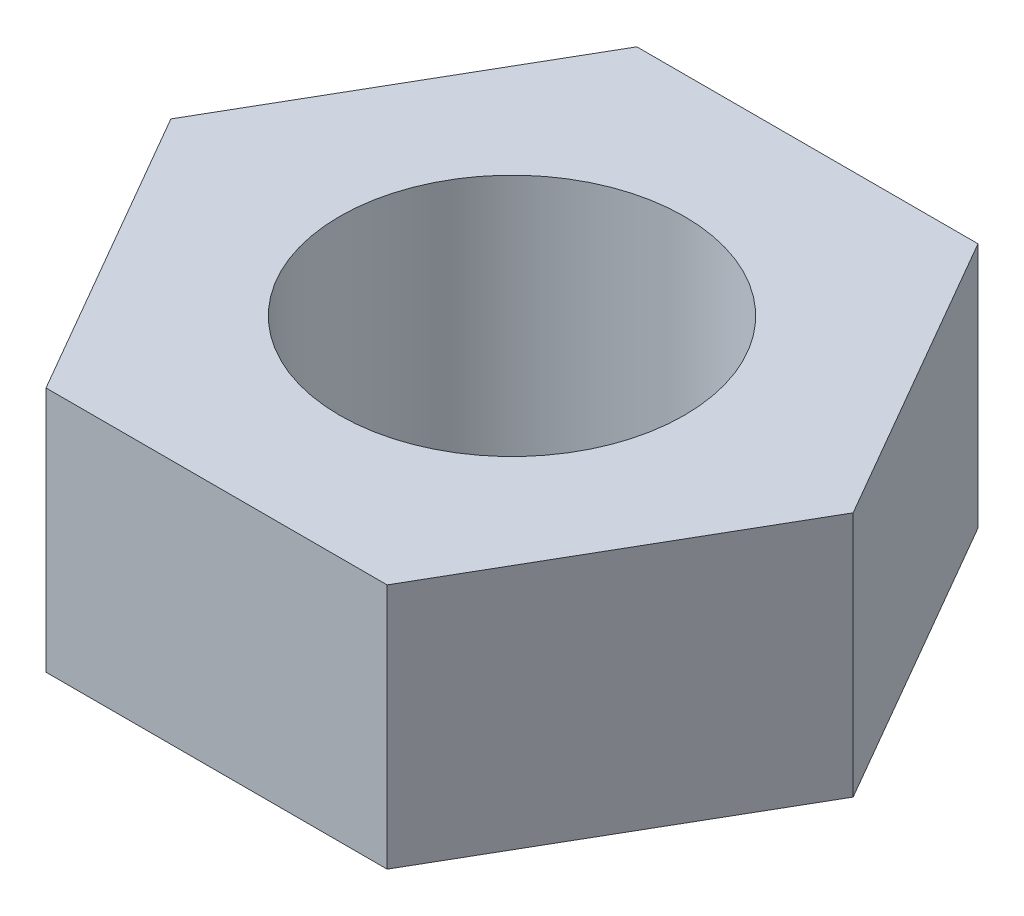
ISO-10303-21;
HEADER;
FILE_DESCRIPTION(('STEP AP214'),'2;1');
FILE_NAME('part.step','',(''),(''),'','','');
FILE_SCHEMA(('AUTOMOTIVE_DESIGN { 1 0 10303 214 1 1 1 1 }'));
ENDSEC;
DATA;
#1=APPLICATION_CONTEXT('core data for automotive mechanical design processes');
#2=APPLICATION_PROTOCOL_DEFINITION('international standard','automotive_design',2000,#1);
#3=PRODUCT_CONTEXT('',#1,'mechanical');
#4=PRODUCT('Part','Part','',(#3));
#5=PRODUCT_RELATED_PRODUCT_CATEGORY('part','',(#4));
#6=PRODUCT_DEFINITION_FORMATION('','',#4);
#7=PRODUCT_DEFINITION_CONTEXT('part definition',#1,'design');
#8=PRODUCT_DEFINITION('design','',#6,#7);
#9=PRODUCT_DEFINITION_SHAPE('','',#8);
#10=(LENGTH_UNIT() NAMED_UNIT(*) SI_UNIT(.MILLI.,.METRE.));
#11=(NAMED_UNIT(*) PLANE_ANGLE_UNIT() SI_UNIT($,.RADIAN.));
#12=(NAMED_UNIT(*) SI_UNIT($,.STERADIAN.) SOLID_ANGLE_UNIT());
#13=UNCERTAINTY_MEASURE_WITH_UNIT(LENGTH_MEASURE(1.E-05),#10,'distance_accuracy_value','');
#14=(GEOMETRIC_REPRESENTATION_CONTEXT(3) GLOBAL_UNCERTAINTY_ASSIGNED_CONTEXT((#13)) GLOBAL_UNIT_ASSIGNED_CONTEXT((#10,
#11,#12)) REPRESENTATION_CONTEXT('',''));
#15=CARTESIAN_POINT('',(0.,0.,0.));
#16=DIRECTION('',(0.,0.,1.));
#17=DIRECTION('',(1.,0.,0.));
#18=AXIS2_PLACEMENT_3D('',#15,#16,#17);
#19=CARTESIAN_POINT('',(13.856406460551,-10.,0.));
#20=DIRECTION('',(0.866025403784439,0.,-0.5));
#21=DIRECTION('',(-0.5,0.,-0.866025403784439));
#22=AXIS2_PLACEMENT_3D('',#19,#20,#21);
#23=PLANE('',#22);
#24=DIRECTION('',(-0.5,0.,-0.866025403784439));
#25=VECTOR('',#24,1.);
#26=CARTESIAN_POINT('',(13.856406460551,0.,0.));
#27=LINE('',#26,#25);
#28=CARTESIAN_POINT('',(13.856406460551,0.,0.));
#29=VERTEX_POINT('',#28);
#30=CARTESIAN_POINT('',(6.92820323027551,0.,-12.));
#31=VERTEX_POINT('',#30);
#32=EDGE_CURVE('E136',#29,#31,#27,.T.);
#33=ORIENTED_EDGE('',*,*,#32,.F.);
#34=DIRECTION('',(0.,1.,0.));
#35=VECTOR('',#34,1.);
#36=CARTESIAN_POINT('',(13.856406460551,-10.,0.));
#37=LINE('',#36,#35);
#38=CARTESIAN_POINT('',(13.856406460551,-10.,0.));
#39=VERTEX_POINT('',#38);
#40=EDGE_CURVE('E11',#39,#29,#37,.T.);
#41=ORIENTED_EDGE('',*,*,#40,.F.);
#42=DIRECTION('',(-0.5,0.,-0.866025403784439));
#43=VECTOR('',#42,1.);
#44=CARTESIAN_POINT('',(13.856406460551,-10.,0.));
#45=LINE('',#44,#43);
#46=CARTESIAN_POINT('',(6.92820323027551,-10.,-12.));
#47=VERTEX_POINT('',#46);
#48=EDGE_CURVE('E157',#39,#47,#45,.T.);
#49=ORIENTED_EDGE('',*,*,#48,.T.);
#50=DIRECTION('',(0.,1.,0.));
#51=VECTOR('',#50,1.);
#52=CARTESIAN_POINT('',(6.92820323027551,-10.,-12.));
#53=LINE('',#52,#51);
#54=EDGE_CURVE('E48',#47,#31,#53,.T.);
#55=ORIENTED_EDGE('',*,*,#54,.T.);
#56=EDGE_LOOP('',(#33,#41,#49,#55));
#57=FACE_BOUND('',#56,.T.);
#58=ADVANCED_FACE('F45',(#57),#23,.T.);
#59=CARTESIAN_POINT('',(6.92820323027552,-10.,12.));
#60=DIRECTION('',(0.866025403784439,0.,0.5));
#61=DIRECTION('',(0.5,0.,-0.866025403784439));
#62=AXIS2_PLACEMENT_3D('',#59,#60,#61);
#63=PLANE('',#62);
#64=DIRECTION('',(0.5,0.,-0.866025403784439));
#65=VECTOR('',#64,1.);
#66=CARTESIAN_POINT('',(6.92820323027552,0.,12.));
#67=LINE('',#66,#65);
#68=CARTESIAN_POINT('',(6.92820323027552,0.,12.));
#69=VERTEX_POINT('',#68);
#70=EDGE_CURVE('E154',#69,#29,#67,.T.);
#71=ORIENTED_EDGE('',*,*,#70,.F.);
#72=DIRECTION('',(0.,1.,0.));
#73=VECTOR('',#72,1.);
#74=CARTESIAN_POINT('',(6.92820323027552,-10.,12.));
#75=LINE('',#74,#73);
#76=CARTESIAN_POINT('',(6.92820323027552,-10.,12.));
#77=VERTEX_POINT('',#76);
#78=EDGE_CURVE('E55',#77,#69,#75,.T.);
#79=ORIENTED_EDGE('',*,*,#78,.F.);
#80=DIRECTION('',(0.5,0.,-0.866025403784439));
#81=VECTOR('',#80,1.);
#82=CARTESIAN_POINT('',(6.92820323027552,-10.,12.));
#83=LINE('',#82,#81);
#84=EDGE_CURVE('E122',#77,#39,#83,.T.);
#85=ORIENTED_EDGE('',*,*,#84,.T.);
#86=ORIENTED_EDGE('',*,*,#40,.T.);
#87=EDGE_LOOP('',(#71,#79,#85,#86));
#88=FACE_BOUND('',#87,.T.);
#89=ADVANCED_FACE('F169',(#88),#63,.T.);
#90=CARTESIAN_POINT('',(-6.92820323027551,-10.,12.));
#91=DIRECTION('',(0.,0.,1.));
#92=DIRECTION('',(1.,0.,0.));
#93=AXIS2_PLACEMENT_3D('',#90,#91,#92);
#94=PLANE('',#93);
#95=DIRECTION('',(1.,0.,0.));
#96=VECTOR('',#95,1.);
#97=CARTESIAN_POINT('',(-6.92820323027551,0.,12.));
#98=LINE('',#97,#96);
#99=CARTESIAN_POINT('',(-6.92820323027551,0.,12.));
#100=VERTEX_POINT('',#99);
#101=EDGE_CURVE('E108',#100,#69,#98,.T.);
#102=ORIENTED_EDGE('',*,*,#101,.F.);
#103=DIRECTION('',(0.,1.,0.));
#104=VECTOR('',#103,1.);
#105=CARTESIAN_POINT('',(-6.92820323027551,-10.,12.));
#106=LINE('',#105,#104);
#107=CARTESIAN_POINT('',(-6.92820323027551,-10.,12.));
#108=VERTEX_POINT('',#107);
#109=EDGE_CURVE('E103',#108,#100,#106,.T.);
#110=ORIENTED_EDGE('',*,*,#109,.F.);
#111=DIRECTION('',(1.,0.,0.));
#112=VECTOR('',#111,1.);
#113=CARTESIAN_POINT('',(-6.92820323027551,-10.,12.));
#114=LINE('',#113,#112);
#115=EDGE_CURVE('E106',#108,#77,#114,.T.);
#116=ORIENTED_EDGE('',*,*,#115,.T.);
#117=ORIENTED_EDGE('',*,*,#78,.T.);
#118=EDGE_LOOP('',(#102,#110,#116,#117));
#119=FACE_BOUND('',#118,.T.);
#120=ADVANCED_FACE('F105',(#119),#94,.T.);
#121=CARTESIAN_POINT('',(-13.856406460551,-10.,0.));
#122=DIRECTION('',(-0.866025403784438,0.,0.5));
#123=DIRECTION('',(0.5,0.,0.866025403784438));
#124=AXIS2_PLACEMENT_3D('',#121,#122,#123);
#125=PLANE('',#124);
#126=DIRECTION('',(0.5,0.,0.866025403784439));
#127=VECTOR('',#126,1.);
#128=CARTESIAN_POINT('',(-13.856406460551,0.,0.));
#129=LINE('',#128,#127);
#130=CARTESIAN_POINT('',(-13.856406460551,0.,0.));
#131=VERTEX_POINT('',#130);
#132=EDGE_CURVE('E149',#131,#100,#129,.T.);
#133=ORIENTED_EDGE('',*,*,#132,.F.);
#134=DIRECTION('',(0.,1.,0.));
#135=VECTOR('',#134,1.);
#136=CARTESIAN_POINT('',(-13.856406460551,-10.,0.));
#137=LINE('',#136,#135);
#138=CARTESIAN_POINT('',(-13.856406460551,-10.,0.));
#139=VERTEX_POINT('',#138);
#140=EDGE_CURVE('E114',#139,#131,#137,.T.);
#141=ORIENTED_EDGE('',*,*,#140,.F.);
#142=DIRECTION('',(0.5,0.,0.866025403784439));
#143=VECTOR('',#142,1.);
#144=CARTESIAN_POINT('',(-13.856406460551,-10.,0.));
#145=LINE('',#144,#143);
#146=EDGE_CURVE('E120',#139,#108,#145,.T.);
#147=ORIENTED_EDGE('',*,*,#146,.T.);
#148=ORIENTED_EDGE('',*,*,#109,.T.);
#149=EDGE_LOOP('',(#133,#141,#147,#148));
#150=FACE_BOUND('',#149,.T.);
#151=ADVANCED_FACE('F125',(#150),#125,.T.);
#152=CARTESIAN_POINT('',(-6.92820323027551,-10.,-12.));
#153=DIRECTION('',(-0.866025403784439,0.,-0.5));
#154=DIRECTION('',(-0.5,0.,0.866025403784439));
#155=AXIS2_PLACEMENT_3D('',#152,#153,#154);
#156=PLANE('',#155);
#157=DIRECTION('',(-0.5,0.,0.866025403784439));
#158=VECTOR('',#157,1.);
#159=CARTESIAN_POINT('',(-6.92820323027551,0.,-12.));
#160=LINE('',#159,#158);
#161=CARTESIAN_POINT('',(-6.92820323027551,0.,-12.));
#162=VERTEX_POINT('',#161);
#163=EDGE_CURVE('E145',#162,#131,#160,.T.);
#164=ORIENTED_EDGE('',*,*,#163,.F.);
#165=DIRECTION('',(0.,1.,0.));
#166=VECTOR('',#165,1.);
#167=CARTESIAN_POINT('',(-6.92820323027551,-10.,-12.));
#168=LINE('',#167,#166);
#169=CARTESIAN_POINT('',(-6.92820323027551,-10.,-12.));
#170=VERTEX_POINT('',#169);
#171=EDGE_CURVE('E162',#170,#162,#168,.T.);
#172=ORIENTED_EDGE('',*,*,#171,.F.);
#173=DIRECTION('',(-0.5,0.,0.866025403784439));
#174=VECTOR('',#173,1.);
#175=CARTESIAN_POINT('',(-6.92820323027551,-10.,-12.));
#176=LINE('',#175,#174);
#177=EDGE_CURVE('E127',#170,#139,#176,.T.);
#178=ORIENTED_EDGE('',*,*,#177,.T.);
#179=ORIENTED_EDGE('',*,*,#140,.T.);
#180=EDGE_LOOP('',(#164,#172,#178,#179));
#181=FACE_BOUND('',#180,.T.);
#182=ADVANCED_FACE('F182',(#181),#156,.T.);
#183=CARTESIAN_POINT('',(6.92820323027551,-10.,-12.));
#184=DIRECTION('',(0.,0.,-1.));
#185=DIRECTION('',(-1.,0.,0.));
#186=AXIS2_PLACEMENT_3D('',#183,#184,#185);
#187=PLANE('',#186);
#188=DIRECTION('',(-1.,0.,0.));
#189=VECTOR('',#188,1.);
#190=CARTESIAN_POINT('',(6.92820323027551,0.,-12.));
#191=LINE('',#190,#189);
#192=EDGE_CURVE('E140',#31,#162,#191,.T.);
#193=ORIENTED_EDGE('',*,*,#192,.F.);
#194=ORIENTED_EDGE('',*,*,#54,.F.);
#195=DIRECTION('',(-1.,0.,0.));
#196=VECTOR('',#195,1.);
#197=CARTESIAN_POINT('',(6.92820323027551,-10.,-12.));
#198=LINE('',#197,#196);
#199=EDGE_CURVE('E130',#47,#170,#198,.T.);
#200=ORIENTED_EDGE('',*,*,#199,.T.);
#201=ORIENTED_EDGE('',*,*,#171,.T.);
#202=EDGE_LOOP('',(#193,#194,#200,#201));
#203=FACE_BOUND('',#202,.T.);
#204=ADVANCED_FACE('F166',(#203),#187,.T.);
#205=CARTESIAN_POINT('',(0.,-10.,0.));
#206=DIRECTION('',(0.,1.,0.));
#207=DIRECTION('',(0.,0.,1.));
#208=AXIS2_PLACEMENT_3D('',#205,#206,#207);
#209=PLANE('',#208);
#210=CARTESIAN_POINT('',(0.,-10.,0.));
#211=DIRECTION('',(0.,1.,0.));
#212=DIRECTION('',(0.,0.,1.));
#213=AXIS2_PLACEMENT_3D('',#210,#211,#212);
#214=CIRCLE('',#213,7.);
#215=CARTESIAN_POINT('',(0.,-10.,7.));
#216=VERTEX_POINT('',#215);
#217=EDGE_CURVE('E141',#216,#216,#214,.T.);
#218=ORIENTED_EDGE('',*,*,#217,.T.);
#219=EDGE_LOOP('',(#218));
#220=FACE_BOUND('',#219,.T.);
#221=ORIENTED_EDGE('',*,*,#48,.F.);
#222=ORIENTED_EDGE('',*,*,#84,.F.);
#223=ORIENTED_EDGE('',*,*,#115,.F.);
#224=ORIENTED_EDGE('',*,*,#146,.F.);
#225=ORIENTED_EDGE('',*,*,#177,.F.);
#226=ORIENTED_EDGE('',*,*,#199,.F.);
#227=EDGE_LOOP('',(#221,#222,#223,#224,#225,#226));
#228=FACE_BOUND('',#227,.T.);
#229=ADVANCED_FACE('F118',(#220,#228),#209,.F.);
#230=CARTESIAN_POINT('',(0.,0.,0.));
#231=DIRECTION('',(0.,1.,0.));
#232=DIRECTION('',(0.,0.,1.));
#233=AXIS2_PLACEMENT_3D('',#230,#231,#232);
#234=PLANE('',#233);
#235=CARTESIAN_POINT('',(0.,0.,0.));
#236=DIRECTION('',(0.,1.,0.));
#237=DIRECTION('',(0.,0.,1.));
#238=AXIS2_PLACEMENT_3D('',#235,#236,#237);
#239=CIRCLE('',#238,7.);
#240=CARTESIAN_POINT('',(0.,0.,7.));
#241=VERTEX_POINT('',#240);
#242=EDGE_CURVE('E205',#241,#241,#239,.T.);
#243=ORIENTED_EDGE('',*,*,#242,.F.);
#244=EDGE_LOOP('',(#243));
#245=FACE_BOUND('',#244,.T.);
#246=ORIENTED_EDGE('',*,*,#32,.T.);
#247=ORIENTED_EDGE('',*,*,#192,.T.);
#248=ORIENTED_EDGE('',*,*,#163,.T.);
#249=ORIENTED_EDGE('',*,*,#132,.T.);
#250=ORIENTED_EDGE('',*,*,#101,.T.);
#251=ORIENTED_EDGE('',*,*,#70,.T.);
#252=EDGE_LOOP('',(#246,#247,#248,#249,#250,#251));
#253=FACE_BOUND('',#252,.T.);
#254=ADVANCED_FACE('F168',(#245,#253),#234,.T.);
#255=CARTESIAN_POINT('',(0.,-10.,0.));
#256=DIRECTION('',(0.,1.,0.));
#257=DIRECTION('',(0.,0.,1.));
#258=AXIS2_PLACEMENT_3D('',#255,#256,#257);
#259=CYLINDRICAL_SURFACE('',#258,7.);
#260=ORIENTED_EDGE('',*,*,#217,.F.);
#261=EDGE_LOOP('',(#260));
#262=FACE_BOUND('',#261,.T.);
#263=ORIENTED_EDGE('',*,*,#242,.T.);
#264=EDGE_LOOP('',(#263));
#265=FACE_BOUND('',#264,.T.);
#266=ADVANCED_FACE('F193',(#262,#265),#259,.F.);
#267=CLOSED_SHELL('',(#58,#89,#120,#151,#182,#204,#229,#254,#266));
#268=MANIFOLD_SOLID_BREP('B2',#267);
#269=ADVANCED_BREP_SHAPE_REPRESENTATION('',(#18,#268),#14);
#270=SHAPE_DEFINITION_REPRESENTATION(#9,#269);
ENDSEC;
END-ISO-10303-21;
